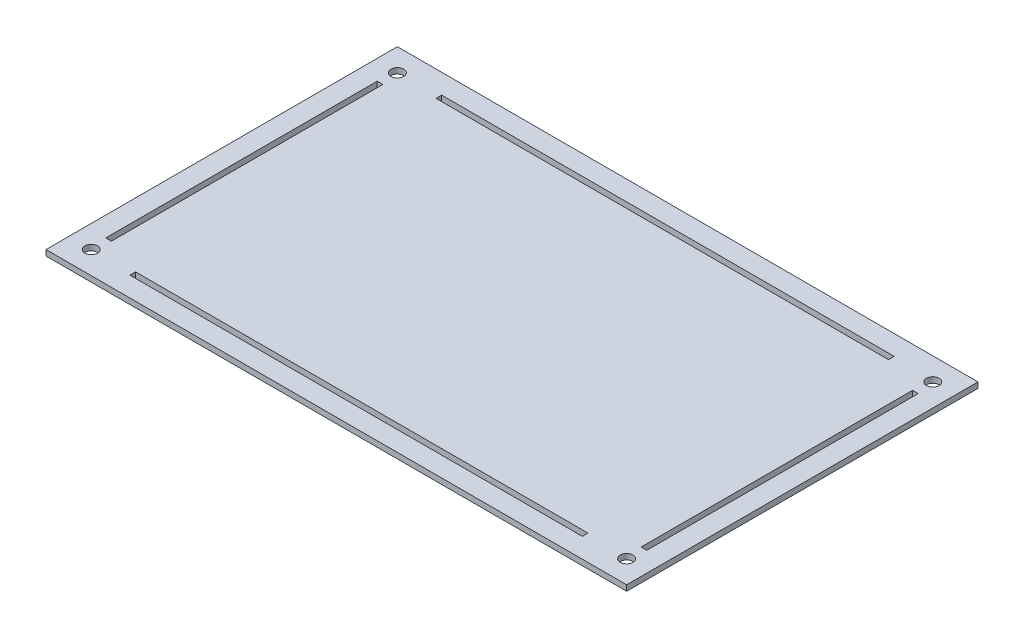
ISO-10303-21;
HEADER;
FILE_DESCRIPTION(('STEP AP214'),'2;1');
FILE_NAME('part.step','',(''),(''),'','','');
FILE_SCHEMA(('AUTOMOTIVE_DESIGN { 1 0 10303 214 1 1 1 1 }'));
ENDSEC;
DATA;
#1=APPLICATION_CONTEXT('core data for automotive mechanical design processes');
#2=APPLICATION_PROTOCOL_DEFINITION('international standard','automotive_design',2000,#1);
#3=PRODUCT_CONTEXT('',#1,'mechanical');
#4=PRODUCT('Part','Part','',(#3));
#5=PRODUCT_RELATED_PRODUCT_CATEGORY('part','',(#4));
#6=PRODUCT_DEFINITION_FORMATION('','',#4);
#7=PRODUCT_DEFINITION_CONTEXT('part definition',#1,'design');
#8=PRODUCT_DEFINITION('design','',#6,#7);
#9=PRODUCT_DEFINITION_SHAPE('','',#8);
#10=(LENGTH_UNIT() NAMED_UNIT(*) SI_UNIT(.MILLI.,.METRE.));
#11=(NAMED_UNIT(*) PLANE_ANGLE_UNIT() SI_UNIT($,.RADIAN.));
#12=(NAMED_UNIT(*) SI_UNIT($,.STERADIAN.) SOLID_ANGLE_UNIT());
#13=UNCERTAINTY_MEASURE_WITH_UNIT(LENGTH_MEASURE(1.E-05),#10,'distance_accuracy_value','');
#14=(GEOMETRIC_REPRESENTATION_CONTEXT(3) GLOBAL_UNCERTAINTY_ASSIGNED_CONTEXT((#13)) GLOBAL_UNIT_ASSIGNED_CONTEXT((#10,
#11,#12)) REPRESENTATION_CONTEXT('',''));
#15=CARTESIAN_POINT('',(0.,0.,0.));
#16=DIRECTION('',(0.,0.,1.));
#17=DIRECTION('',(1.,0.,0.));
#18=AXIS2_PLACEMENT_3D('',#15,#16,#17);
#19=CARTESIAN_POINT('',(-162.9918,3.175,-98.63963));
#20=DIRECTION('',(1.,0.,0.));
#21=DIRECTION('',(0.,0.,-1.));
#22=AXIS2_PLACEMENT_3D('',#19,#20,#21);
#23=PLANE('',#22);
#24=DIRECTION('',(0.,0.,1.));
#25=VECTOR('',#24,1.);
#26=CARTESIAN_POINT('',(-162.9918,0.,-98.63963));
#27=LINE('',#26,#25);
#28=CARTESIAN_POINT('',(-162.9918,0.,-98.63963));
#29=VERTEX_POINT('',#28);
#30=CARTESIAN_POINT('',(-162.9918,0.,98.63963));
#31=VERTEX_POINT('',#30);
#32=EDGE_CURVE('E332',#29,#31,#27,.T.);
#33=ORIENTED_EDGE('',*,*,#32,.T.);
#34=DIRECTION('',(0.,-1.,0.));
#35=VECTOR('',#34,1.);
#36=CARTESIAN_POINT('',(-162.9918,3.175,98.63963));
#37=LINE('',#36,#35);
#38=CARTESIAN_POINT('',(-162.9918,3.175,98.63963));
#39=VERTEX_POINT('',#38);
#40=EDGE_CURVE('E11',#39,#31,#37,.T.);
#41=ORIENTED_EDGE('',*,*,#40,.F.);
#42=DIRECTION('',(0.,0.,1.));
#43=VECTOR('',#42,1.);
#44=CARTESIAN_POINT('',(-162.9918,3.175,-98.63963));
#45=LINE('',#44,#43);
#46=CARTESIAN_POINT('',(-162.9918,3.175,-98.63963));
#47=VERTEX_POINT('',#46);
#48=EDGE_CURVE('E333',#47,#39,#45,.T.);
#49=ORIENTED_EDGE('',*,*,#48,.F.);
#50=DIRECTION('',(0.,-1.,0.));
#51=VECTOR('',#50,1.);
#52=CARTESIAN_POINT('',(-162.9918,3.175,-98.63963));
#53=LINE('',#52,#51);
#54=EDGE_CURVE('E343',#47,#29,#53,.T.);
#55=ORIENTED_EDGE('',*,*,#54,.T.);
#56=EDGE_LOOP('',(#33,#41,#49,#55));
#57=FACE_BOUND('',#56,.T.);
#58=ADVANCED_FACE('F39',(#57),#23,.F.);
#59=CARTESIAN_POINT('',(-162.9918,3.175,98.63963));
#60=DIRECTION('',(0.,0.,-1.));
#61=DIRECTION('',(-1.,0.,0.));
#62=AXIS2_PLACEMENT_3D('',#59,#60,#61);
#63=PLANE('',#62);
#64=DIRECTION('',(1.,0.,0.));
#65=VECTOR('',#64,1.);
#66=CARTESIAN_POINT('',(-162.9918,0.,98.63963));
#67=LINE('',#66,#65);
#68=CARTESIAN_POINT('',(162.9918,0.,98.63963));
#69=VERTEX_POINT('',#68);
#70=EDGE_CURVE('E346',#31,#69,#67,.T.);
#71=ORIENTED_EDGE('',*,*,#70,.T.);
#72=DIRECTION('',(0.,-1.,0.));
#73=VECTOR('',#72,1.);
#74=CARTESIAN_POINT('',(162.9918,3.175,98.63963));
#75=LINE('',#74,#73);
#76=CARTESIAN_POINT('',(162.9918,3.175,98.63963));
#77=VERTEX_POINT('',#76);
#78=EDGE_CURVE('E46',#77,#69,#75,.T.);
#79=ORIENTED_EDGE('',*,*,#78,.F.);
#80=DIRECTION('',(1.,0.,0.));
#81=VECTOR('',#80,1.);
#82=CARTESIAN_POINT('',(-162.9918,3.175,98.63963));
#83=LINE('',#82,#81);
#84=EDGE_CURVE('E336',#39,#77,#83,.T.);
#85=ORIENTED_EDGE('',*,*,#84,.F.);
#86=ORIENTED_EDGE('',*,*,#40,.T.);
#87=EDGE_LOOP('',(#71,#79,#85,#86));
#88=FACE_BOUND('',#87,.T.);
#89=ADVANCED_FACE('F375',(#88),#63,.F.);
#90=CARTESIAN_POINT('',(162.9918,3.175,-98.63963));
#91=DIRECTION('',(-1.,0.,0.));
#92=DIRECTION('',(0.,0.,1.));
#93=AXIS2_PLACEMENT_3D('',#90,#91,#92);
#94=PLANE('',#93);
#95=DIRECTION('',(0.,0.,-1.));
#96=VECTOR('',#95,1.);
#97=CARTESIAN_POINT('',(162.9918,0.,-98.63963));
#98=LINE('',#97,#96);
#99=CARTESIAN_POINT('',(162.9918,0.,-98.63963));
#100=VERTEX_POINT('',#99);
#101=EDGE_CURVE('E348',#69,#100,#98,.T.);
#102=ORIENTED_EDGE('',*,*,#101,.T.);
#103=DIRECTION('',(0.,-1.,0.));
#104=VECTOR('',#103,1.);
#105=CARTESIAN_POINT('',(162.9918,3.175,-98.63963));
#106=LINE('',#105,#104);
#107=CARTESIAN_POINT('',(162.9918,3.175,-98.63963));
#108=VERTEX_POINT('',#107);
#109=EDGE_CURVE('E353',#108,#100,#106,.T.);
#110=ORIENTED_EDGE('',*,*,#109,.F.);
#111=DIRECTION('',(0.,0.,-1.));
#112=VECTOR('',#111,1.);
#113=CARTESIAN_POINT('',(162.9918,3.175,-98.63963));
#114=LINE('',#113,#112);
#115=EDGE_CURVE('E339',#77,#108,#114,.T.);
#116=ORIENTED_EDGE('',*,*,#115,.F.);
#117=ORIENTED_EDGE('',*,*,#78,.T.);
#118=EDGE_LOOP('',(#102,#110,#116,#117));
#119=FACE_BOUND('',#118,.T.);
#120=ADVANCED_FACE('F360',(#119),#94,.F.);
#121=CARTESIAN_POINT('',(-162.9918,3.175,-98.63963));
#122=DIRECTION('',(0.,0.,1.));
#123=DIRECTION('',(1.,0.,0.));
#124=AXIS2_PLACEMENT_3D('',#121,#122,#123);
#125=PLANE('',#124);
#126=DIRECTION('',(-1.,0.,0.));
#127=VECTOR('',#126,1.);
#128=CARTESIAN_POINT('',(-162.9918,0.,-98.63963));
#129=LINE('',#128,#127);
#130=EDGE_CURVE('E337',#100,#29,#129,.T.);
#131=ORIENTED_EDGE('',*,*,#130,.T.);
#132=ORIENTED_EDGE('',*,*,#54,.F.);
#133=DIRECTION('',(-1.,0.,0.));
#134=VECTOR('',#133,1.);
#135=CARTESIAN_POINT('',(-162.9918,3.175,-98.63963));
#136=LINE('',#135,#134);
#137=EDGE_CURVE('E341',#108,#47,#136,.T.);
#138=ORIENTED_EDGE('',*,*,#137,.F.);
#139=ORIENTED_EDGE('',*,*,#109,.T.);
#140=EDGE_LOOP('',(#131,#132,#138,#139));
#141=FACE_BOUND('',#140,.T.);
#142=ADVANCED_FACE('F368',(#141),#125,.F.);
#143=CARTESIAN_POINT('',(0.,3.175,0.));
#144=DIRECTION('',(0.,1.,0.));
#145=DIRECTION('',(0.,0.,1.));
#146=AXIS2_PLACEMENT_3D('',#143,#144,#145);
#147=PLANE('',#146);
#148=DIRECTION('',(0.,0.,1.));
#149=VECTOR('',#148,1.);
#150=CARTESIAN_POINT('',(-151.8793,3.175,-76.1999999999992));
#151=LINE('',#150,#149);
#152=CARTESIAN_POINT('',(-151.8793,3.175,-76.1999999999992));
#153=VERTEX_POINT('',#152);
#154=CARTESIAN_POINT('',(-151.8793,3.175,76.2000000000008));
#155=VERTEX_POINT('',#154);
#156=EDGE_CURVE('E53',#153,#155,#151,.T.);
#157=ORIENTED_EDGE('',*,*,#156,.F.);
#158=DIRECTION('',(-1.,0.,0.));
#159=VECTOR('',#158,1.);
#160=CARTESIAN_POINT('',(-151.8793,3.175,-76.1999999999992));
#161=LINE('',#160,#159);
#162=CARTESIAN_POINT('',(-148.7043,3.175,-76.1999999999992));
#163=VERTEX_POINT('',#162);
#164=EDGE_CURVE('E196',#163,#153,#161,.T.);
#165=ORIENTED_EDGE('',*,*,#164,.F.);
#166=DIRECTION('',(0.,0.,-1.));
#167=VECTOR('',#166,1.);
#168=CARTESIAN_POINT('',(-148.7043,3.175,-76.1999999999992));
#169=LINE('',#168,#167);
#170=CARTESIAN_POINT('',(-148.7043,3.175,76.2000000000008));
#171=VERTEX_POINT('',#170);
#172=EDGE_CURVE('E199',#171,#163,#169,.T.);
#173=ORIENTED_EDGE('',*,*,#172,.F.);
#174=DIRECTION('',(1.,0.,0.));
#175=VECTOR('',#174,1.);
#176=CARTESIAN_POINT('',(-151.8793,3.175,76.2000000000008));
#177=LINE('',#176,#175);
#178=EDGE_CURVE('E205',#155,#171,#177,.T.);
#179=ORIENTED_EDGE('',*,*,#178,.F.);
#180=EDGE_LOOP('',(#157,#165,#173,#179));
#181=FACE_BOUND('',#180,.T.);
#182=DIRECTION('',(0.,0.,-1.));
#183=VECTOR('',#182,1.);
#184=CARTESIAN_POINT('',(151.8793,3.175,-76.1999999999992));
#185=LINE('',#184,#183);
#186=CARTESIAN_POINT('',(151.8793,3.175,76.2000000000008));
#187=VERTEX_POINT('',#186);
#188=CARTESIAN_POINT('',(151.8793,3.175,-76.1999999999992));
#189=VERTEX_POINT('',#188);
#190=EDGE_CURVE('E61',#187,#189,#185,.T.);
#191=ORIENTED_EDGE('',*,*,#190,.F.);
#192=DIRECTION('',(1.,0.,0.));
#193=VECTOR('',#192,1.);
#194=CARTESIAN_POINT('',(151.8793,3.175,76.2000000000008));
#195=LINE('',#194,#193);
#196=CARTESIAN_POINT('',(148.7043,3.175,76.2000000000008));
#197=VERTEX_POINT('',#196);
#198=EDGE_CURVE('E225',#197,#187,#195,.T.);
#199=ORIENTED_EDGE('',*,*,#198,.F.);
#200=DIRECTION('',(0.,0.,1.));
#201=VECTOR('',#200,1.);
#202=CARTESIAN_POINT('',(148.7043,3.175,-76.1999999999992));
#203=LINE('',#202,#201);
#204=CARTESIAN_POINT('',(148.7043,3.175,-76.1999999999992));
#205=VERTEX_POINT('',#204);
#206=EDGE_CURVE('E228',#205,#197,#203,.T.);
#207=ORIENTED_EDGE('',*,*,#206,.F.);
#208=DIRECTION('',(-1.,0.,0.));
#209=VECTOR('',#208,1.);
#210=CARTESIAN_POINT('',(151.8793,3.175,-76.1999999999992));
#211=LINE('',#210,#209);
#212=EDGE_CURVE('E232',#189,#205,#211,.T.);
#213=ORIENTED_EDGE('',*,*,#212,.F.);
#214=EDGE_LOOP('',(#191,#199,#207,#213));
#215=FACE_BOUND('',#214,.T.);
#216=DIRECTION('',(0.,0.,1.));
#217=VECTOR('',#216,1.);
#218=CARTESIAN_POINT('',(-127.,3.175,-87.52713));
#219=LINE('',#218,#217);
#220=CARTESIAN_POINT('',(-127.,3.175,-87.52713));
#221=VERTEX_POINT('',#220);
#222=CARTESIAN_POINT('',(-127.,3.175,-84.35213));
#223=VERTEX_POINT('',#222);
#224=EDGE_CURVE('E224',#221,#223,#219,.T.);
#225=ORIENTED_EDGE('',*,*,#224,.F.);
#226=DIRECTION('',(-1.,0.,0.));
#227=VECTOR('',#226,1.);
#228=CARTESIAN_POINT('',(-127.,3.175,-87.52713));
#229=LINE('',#228,#227);
#230=CARTESIAN_POINT('',(127.,3.175,-87.52713));
#231=VERTEX_POINT('',#230);
#232=EDGE_CURVE('E257',#231,#221,#229,.T.);
#233=ORIENTED_EDGE('',*,*,#232,.F.);
#234=DIRECTION('',(0.,0.,-1.));
#235=VECTOR('',#234,1.);
#236=CARTESIAN_POINT('',(127.,3.175,-87.52713));
#237=LINE('',#236,#235);
#238=CARTESIAN_POINT('',(127.,3.175,-84.35213));
#239=VERTEX_POINT('',#238);
#240=EDGE_CURVE('E260',#239,#231,#237,.T.);
#241=ORIENTED_EDGE('',*,*,#240,.F.);
#242=DIRECTION('',(1.,0.,0.));
#243=VECTOR('',#242,1.);
#244=CARTESIAN_POINT('',(-127.,3.175,-84.35213));
#245=LINE('',#244,#243);
#246=EDGE_CURVE('E264',#223,#239,#245,.T.);
#247=ORIENTED_EDGE('',*,*,#246,.F.);
#248=EDGE_LOOP('',(#225,#233,#241,#247));
#249=FACE_BOUND('',#248,.T.);
#250=DIRECTION('',(0.,0.,1.));
#251=VECTOR('',#250,1.);
#252=CARTESIAN_POINT('',(-127.,3.175,87.52713));
#253=LINE('',#252,#251);
#254=CARTESIAN_POINT('',(-127.,3.175,84.35213));
#255=VERTEX_POINT('',#254);
#256=CARTESIAN_POINT('',(-127.,3.175,87.52713));
#257=VERTEX_POINT('',#256);
#258=EDGE_CURVE('E256',#255,#257,#253,.T.);
#259=ORIENTED_EDGE('',*,*,#258,.F.);
#260=DIRECTION('',(-1.,0.,0.));
#261=VECTOR('',#260,1.);
#262=CARTESIAN_POINT('',(-127.,3.175,84.35213));
#263=LINE('',#262,#261);
#264=CARTESIAN_POINT('',(127.,3.175,84.35213));
#265=VERTEX_POINT('',#264);
#266=EDGE_CURVE('E288',#265,#255,#263,.T.);
#267=ORIENTED_EDGE('',*,*,#266,.F.);
#268=DIRECTION('',(0.,0.,-1.));
#269=VECTOR('',#268,1.);
#270=CARTESIAN_POINT('',(127.,3.175,87.52713));
#271=LINE('',#270,#269);
#272=CARTESIAN_POINT('',(127.,3.175,87.52713));
#273=VERTEX_POINT('',#272);
#274=EDGE_CURVE('E291',#273,#265,#271,.T.);
#275=ORIENTED_EDGE('',*,*,#274,.F.);
#276=DIRECTION('',(1.,0.,0.));
#277=VECTOR('',#276,1.);
#278=CARTESIAN_POINT('',(-127.,3.175,87.52713));
#279=LINE('',#278,#277);
#280=EDGE_CURVE('E295',#257,#273,#279,.T.);
#281=ORIENTED_EDGE('',*,*,#280,.F.);
#282=EDGE_LOOP('',(#259,#267,#275,#281));
#283=FACE_BOUND('',#282,.T.);
#284=CARTESIAN_POINT('',(-150.2918,3.175,-85.93963));
#285=DIRECTION('',(0.,1.,0.));
#286=DIRECTION('',(0.,0.,1.));
#287=AXIS2_PLACEMENT_3D('',#284,#285,#286);
#288=CIRCLE('',#287,3.57123999999998);
#289=CARTESIAN_POINT('',(-150.2918,3.175,-82.36839));
#290=VERTEX_POINT('',#289);
#291=EDGE_CURVE('E211',#290,#290,#288,.T.);
#292=ORIENTED_EDGE('',*,*,#291,.F.);
#293=EDGE_LOOP('',(#292));
#294=FACE_BOUND('',#293,.T.);
#295=CARTESIAN_POINT('',(150.2918,3.175,-85.93963));
#296=DIRECTION('',(0.,1.,0.));
#297=DIRECTION('',(0.,0.,1.));
#298=AXIS2_PLACEMENT_3D('',#295,#296,#297);
#299=CIRCLE('',#298,3.57123999999998);
#300=CARTESIAN_POINT('',(150.2918,3.175,-82.36839));
#301=VERTEX_POINT('',#300);
#302=EDGE_CURVE('E314',#301,#301,#299,.T.);
#303=ORIENTED_EDGE('',*,*,#302,.F.);
#304=EDGE_LOOP('',(#303));
#305=FACE_BOUND('',#304,.T.);
#306=CARTESIAN_POINT('',(150.2918,3.175,85.93963));
#307=DIRECTION('',(0.,1.,0.));
#308=DIRECTION('',(0.,0.,1.));
#309=AXIS2_PLACEMENT_3D('',#306,#307,#308);
#310=CIRCLE('',#309,3.57123999999998);
#311=CARTESIAN_POINT('',(150.2918,3.175,89.51087));
#312=VERTEX_POINT('',#311);
#313=EDGE_CURVE('E320',#312,#312,#310,.T.);
#314=ORIENTED_EDGE('',*,*,#313,.F.);
#315=EDGE_LOOP('',(#314));
#316=FACE_BOUND('',#315,.T.);
#317=CARTESIAN_POINT('',(-150.2918,3.175,85.93963));
#318=DIRECTION('',(0.,1.,0.));
#319=DIRECTION('',(0.,0.,1.));
#320=AXIS2_PLACEMENT_3D('',#317,#318,#319);
#321=CIRCLE('',#320,3.57123999999998);
#322=CARTESIAN_POINT('',(-150.2918,3.175,89.51087));
#323=VERTEX_POINT('',#322);
#324=EDGE_CURVE('E326',#323,#323,#321,.T.);
#325=ORIENTED_EDGE('',*,*,#324,.F.);
#326=EDGE_LOOP('',(#325));
#327=FACE_BOUND('',#326,.T.);
#328=ORIENTED_EDGE('',*,*,#48,.T.);
#329=ORIENTED_EDGE('',*,*,#84,.T.);
#330=ORIENTED_EDGE('',*,*,#115,.T.);
#331=ORIENTED_EDGE('',*,*,#137,.T.);
#332=EDGE_LOOP('',(#328,#329,#330,#331));
#333=FACE_BOUND('',#332,.T.);
#334=ADVANCED_FACE('F374',(#181,#215,#249,#283,#294,#305,#316,#327,#333),#147,.T.);
#335=CARTESIAN_POINT('',(0.,0.,0.));
#336=DIRECTION('',(0.,1.,0.));
#337=DIRECTION('',(0.,0.,1.));
#338=AXIS2_PLACEMENT_3D('',#335,#336,#337);
#339=PLANE('',#338);
#340=DIRECTION('',(-1.,0.,0.));
#341=VECTOR('',#340,1.);
#342=CARTESIAN_POINT('',(-151.8793,0.,-76.1999999999992));
#343=LINE('',#342,#341);
#344=CARTESIAN_POINT('',(-148.7043,0.,-76.1999999999992));
#345=VERTEX_POINT('',#344);
#346=CARTESIAN_POINT('',(-151.8793,0.,-76.1999999999992));
#347=VERTEX_POINT('',#346);
#348=EDGE_CURVE('E183',#345,#347,#343,.T.);
#349=ORIENTED_EDGE('',*,*,#348,.T.);
#350=DIRECTION('',(0.,0.,1.));
#351=VECTOR('',#350,1.);
#352=CARTESIAN_POINT('',(-151.8793,0.,-76.1999999999992));
#353=LINE('',#352,#351);
#354=CARTESIAN_POINT('',(-151.8793,0.,76.2000000000008));
#355=VERTEX_POINT('',#354);
#356=EDGE_CURVE('E177',#347,#355,#353,.T.);
#357=ORIENTED_EDGE('',*,*,#356,.T.);
#358=DIRECTION('',(1.,0.,0.));
#359=VECTOR('',#358,1.);
#360=CARTESIAN_POINT('',(-151.8793,0.,76.2000000000008));
#361=LINE('',#360,#359);
#362=CARTESIAN_POINT('',(-148.7043,0.,76.2000000000008));
#363=VERTEX_POINT('',#362);
#364=EDGE_CURVE('E187',#355,#363,#361,.T.);
#365=ORIENTED_EDGE('',*,*,#364,.T.);
#366=DIRECTION('',(0.,0.,-1.));
#367=VECTOR('',#366,1.);
#368=CARTESIAN_POINT('',(-148.7043,0.,-76.1999999999992));
#369=LINE('',#368,#367);
#370=EDGE_CURVE('E191',#363,#345,#369,.T.);
#371=ORIENTED_EDGE('',*,*,#370,.T.);
#372=EDGE_LOOP('',(#349,#357,#365,#371));
#373=FACE_BOUND('',#372,.T.);
#374=DIRECTION('',(1.,0.,0.));
#375=VECTOR('',#374,1.);
#376=CARTESIAN_POINT('',(151.8793,0.,76.2000000000008));
#377=LINE('',#376,#375);
#378=CARTESIAN_POINT('',(148.7043,0.,76.2000000000008));
#379=VERTEX_POINT('',#378);
#380=CARTESIAN_POINT('',(151.8793,0.,76.2000000000008));
#381=VERTEX_POINT('',#380);
#382=EDGE_CURVE('E217',#379,#381,#377,.T.);
#383=ORIENTED_EDGE('',*,*,#382,.T.);
#384=DIRECTION('',(0.,0.,-1.));
#385=VECTOR('',#384,1.);
#386=CARTESIAN_POINT('',(151.8793,0.,-76.1999999999992));
#387=LINE('',#386,#385);
#388=CARTESIAN_POINT('',(151.8793,0.,-76.1999999999992));
#389=VERTEX_POINT('',#388);
#390=EDGE_CURVE('E229',#381,#389,#387,.T.);
#391=ORIENTED_EDGE('',*,*,#390,.T.);
#392=DIRECTION('',(-1.,0.,0.));
#393=VECTOR('',#392,1.);
#394=CARTESIAN_POINT('',(151.8793,0.,-76.1999999999992));
#395=LINE('',#394,#393);
#396=CARTESIAN_POINT('',(148.7043,0.,-76.1999999999992));
#397=VERTEX_POINT('',#396);
#398=EDGE_CURVE('E241',#389,#397,#395,.T.);
#399=ORIENTED_EDGE('',*,*,#398,.T.);
#400=DIRECTION('',(0.,0.,1.));
#401=VECTOR('',#400,1.);
#402=CARTESIAN_POINT('',(148.7043,0.,-76.1999999999992));
#403=LINE('',#402,#401);
#404=EDGE_CURVE('E238',#397,#379,#403,.T.);
#405=ORIENTED_EDGE('',*,*,#404,.T.);
#406=EDGE_LOOP('',(#383,#391,#399,#405));
#407=FACE_BOUND('',#406,.T.);
#408=DIRECTION('',(-1.,0.,0.));
#409=VECTOR('',#408,1.);
#410=CARTESIAN_POINT('',(-127.,0.,-87.52713));
#411=LINE('',#410,#409);
#412=CARTESIAN_POINT('',(127.,0.,-87.52713));
#413=VERTEX_POINT('',#412);
#414=CARTESIAN_POINT('',(-127.,0.,-87.52713));
#415=VERTEX_POINT('',#414);
#416=EDGE_CURVE('E249',#413,#415,#411,.T.);
#417=ORIENTED_EDGE('',*,*,#416,.T.);
#418=DIRECTION('',(0.,0.,1.));
#419=VECTOR('',#418,1.);
#420=CARTESIAN_POINT('',(-127.,0.,-87.52713));
#421=LINE('',#420,#419);
#422=CARTESIAN_POINT('',(-127.,0.,-84.35213));
#423=VERTEX_POINT('',#422);
#424=EDGE_CURVE('E261',#415,#423,#421,.T.);
#425=ORIENTED_EDGE('',*,*,#424,.T.);
#426=DIRECTION('',(1.,0.,0.));
#427=VECTOR('',#426,1.);
#428=CARTESIAN_POINT('',(-127.,0.,-84.35213));
#429=LINE('',#428,#427);
#430=CARTESIAN_POINT('',(127.,0.,-84.35213));
#431=VERTEX_POINT('',#430);
#432=EDGE_CURVE('E273',#423,#431,#429,.T.);
#433=ORIENTED_EDGE('',*,*,#432,.T.);
#434=DIRECTION('',(0.,0.,-1.));
#435=VECTOR('',#434,1.);
#436=CARTESIAN_POINT('',(127.,0.,-87.52713));
#437=LINE('',#436,#435);
#438=EDGE_CURVE('E270',#431,#413,#437,.T.);
#439=ORIENTED_EDGE('',*,*,#438,.T.);
#440=EDGE_LOOP('',(#417,#425,#433,#439));
#441=FACE_BOUND('',#440,.T.);
#442=DIRECTION('',(-1.,0.,0.));
#443=VECTOR('',#442,1.);
#444=CARTESIAN_POINT('',(-127.,0.,84.35213));
#445=LINE('',#444,#443);
#446=CARTESIAN_POINT('',(127.,0.,84.35213));
#447=VERTEX_POINT('',#446);
#448=CARTESIAN_POINT('',(-127.,0.,84.35213));
#449=VERTEX_POINT('',#448);
#450=EDGE_CURVE('E281',#447,#449,#445,.T.);
#451=ORIENTED_EDGE('',*,*,#450,.T.);
#452=DIRECTION('',(0.,0.,1.));
#453=VECTOR('',#452,1.);
#454=CARTESIAN_POINT('',(-127.,0.,87.52713));
#455=LINE('',#454,#453);
#456=CARTESIAN_POINT('',(-127.,0.,87.52713));
#457=VERTEX_POINT('',#456);
#458=EDGE_CURVE('E292',#449,#457,#455,.T.);
#459=ORIENTED_EDGE('',*,*,#458,.T.);
#460=DIRECTION('',(1.,0.,0.));
#461=VECTOR('',#460,1.);
#462=CARTESIAN_POINT('',(-127.,0.,87.52713));
#463=LINE('',#462,#461);
#464=CARTESIAN_POINT('',(127.,0.,87.52713));
#465=VERTEX_POINT('',#464);
#466=EDGE_CURVE('E304',#457,#465,#463,.T.);
#467=ORIENTED_EDGE('',*,*,#466,.T.);
#468=DIRECTION('',(0.,0.,-1.));
#469=VECTOR('',#468,1.);
#470=CARTESIAN_POINT('',(127.,0.,87.52713));
#471=LINE('',#470,#469);
#472=EDGE_CURVE('E301',#465,#447,#471,.T.);
#473=ORIENTED_EDGE('',*,*,#472,.T.);
#474=EDGE_LOOP('',(#451,#459,#467,#473));
#475=FACE_BOUND('',#474,.T.);
#476=CARTESIAN_POINT('',(-150.2918,0.,-85.93963));
#477=DIRECTION('',(0.,1.,0.));
#478=DIRECTION('',(0.,0.,1.));
#479=AXIS2_PLACEMENT_3D('',#476,#477,#478);
#480=CIRCLE('',#479,3.57124);
#481=CARTESIAN_POINT('',(-150.2918,0.,-82.36839));
#482=VERTEX_POINT('',#481);
#483=EDGE_CURVE('E311',#482,#482,#480,.T.);
#484=ORIENTED_EDGE('',*,*,#483,.T.);
#485=EDGE_LOOP('',(#484));
#486=FACE_BOUND('',#485,.T.);
#487=CARTESIAN_POINT('',(150.2918,0.,-85.93963));
#488=DIRECTION('',(0.,1.,0.));
#489=DIRECTION('',(0.,0.,1.));
#490=AXIS2_PLACEMENT_3D('',#487,#488,#489);
#491=CIRCLE('',#490,3.57124);
#492=CARTESIAN_POINT('',(150.2918,0.,-82.36839));
#493=VERTEX_POINT('',#492);
#494=EDGE_CURVE('E317',#493,#493,#491,.T.);
#495=ORIENTED_EDGE('',*,*,#494,.T.);
#496=EDGE_LOOP('',(#495));
#497=FACE_BOUND('',#496,.T.);
#498=CARTESIAN_POINT('',(150.2918,0.,85.93963));
#499=DIRECTION('',(0.,1.,0.));
#500=DIRECTION('',(0.,0.,1.));
#501=AXIS2_PLACEMENT_3D('',#498,#499,#500);
#502=CIRCLE('',#501,3.57124);
#503=CARTESIAN_POINT('',(150.2918,0.,89.51087));
#504=VERTEX_POINT('',#503);
#505=EDGE_CURVE('E323',#504,#504,#502,.T.);
#506=ORIENTED_EDGE('',*,*,#505,.T.);
#507=EDGE_LOOP('',(#506));
#508=FACE_BOUND('',#507,.T.);
#509=CARTESIAN_POINT('',(-150.2918,0.,85.93963));
#510=DIRECTION('',(0.,1.,0.));
#511=DIRECTION('',(0.,0.,1.));
#512=AXIS2_PLACEMENT_3D('',#509,#510,#511);
#513=CIRCLE('',#512,3.57124);
#514=CARTESIAN_POINT('',(-150.2918,0.,89.51087));
#515=VERTEX_POINT('',#514);
#516=EDGE_CURVE('E329',#515,#515,#513,.T.);
#517=ORIENTED_EDGE('',*,*,#516,.T.);
#518=EDGE_LOOP('',(#517));
#519=FACE_BOUND('',#518,.T.);
#520=ORIENTED_EDGE('',*,*,#32,.F.);
#521=ORIENTED_EDGE('',*,*,#130,.F.);
#522=ORIENTED_EDGE('',*,*,#101,.F.);
#523=ORIENTED_EDGE('',*,*,#70,.F.);
#524=EDGE_LOOP('',(#520,#521,#522,#523));
#525=FACE_BOUND('',#524,.T.);
#526=ADVANCED_FACE('F193',(#373,#407,#441,#475,#486,#497,#508,#519,#525),#339,.F.);
#527=CARTESIAN_POINT('',(-150.2918,3.175,85.93963));
#528=DIRECTION('',(0.,1.,0.));
#529=DIRECTION('',(0.,0.,1.));
#530=AXIS2_PLACEMENT_3D('',#527,#528,#529);
#531=CYLINDRICAL_SURFACE('',#530,3.57123999999999);
#532=ORIENTED_EDGE('',*,*,#516,.F.);
#533=EDGE_LOOP('',(#532));
#534=FACE_BOUND('',#533,.T.);
#535=ORIENTED_EDGE('',*,*,#324,.T.);
#536=EDGE_LOOP('',(#535));
#537=FACE_BOUND('',#536,.T.);
#538=ADVANCED_FACE('F387',(#534,#537),#531,.F.);
#539=CARTESIAN_POINT('',(150.2918,3.175,85.93963));
#540=DIRECTION('',(0.,1.,0.));
#541=DIRECTION('',(0.,0.,1.));
#542=AXIS2_PLACEMENT_3D('',#539,#540,#541);
#543=CYLINDRICAL_SURFACE('',#542,3.57123999999999);
#544=ORIENTED_EDGE('',*,*,#505,.F.);
#545=EDGE_LOOP('',(#544));
#546=FACE_BOUND('',#545,.T.);
#547=ORIENTED_EDGE('',*,*,#313,.T.);
#548=EDGE_LOOP('',(#547));
#549=FACE_BOUND('',#548,.T.);
#550=ADVANCED_FACE('F393',(#546,#549),#543,.F.);
#551=CARTESIAN_POINT('',(150.2918,3.175,-85.93963));
#552=DIRECTION('',(0.,1.,0.));
#553=DIRECTION('',(0.,0.,1.));
#554=AXIS2_PLACEMENT_3D('',#551,#552,#553);
#555=CYLINDRICAL_SURFACE('',#554,3.57123999999999);
#556=ORIENTED_EDGE('',*,*,#494,.F.);
#557=EDGE_LOOP('',(#556));
#558=FACE_BOUND('',#557,.T.);
#559=ORIENTED_EDGE('',*,*,#302,.T.);
#560=EDGE_LOOP('',(#559));
#561=FACE_BOUND('',#560,.T.);
#562=ADVANCED_FACE('F397',(#558,#561),#555,.F.);
#563=CARTESIAN_POINT('',(-150.2918,3.175,-85.93963));
#564=DIRECTION('',(0.,1.,0.));
#565=DIRECTION('',(0.,0.,1.));
#566=AXIS2_PLACEMENT_3D('',#563,#564,#565);
#567=CYLINDRICAL_SURFACE('',#566,3.57123999999999);
#568=ORIENTED_EDGE('',*,*,#483,.F.);
#569=EDGE_LOOP('',(#568));
#570=FACE_BOUND('',#569,.T.);
#571=ORIENTED_EDGE('',*,*,#291,.T.);
#572=EDGE_LOOP('',(#571));
#573=FACE_BOUND('',#572,.T.);
#574=ADVANCED_FACE('F401',(#570,#573),#567,.F.);
#575=CARTESIAN_POINT('',(-127.,0.,87.52713));
#576=DIRECTION('',(-1.,0.,0.));
#577=DIRECTION('',(0.,0.,1.));
#578=AXIS2_PLACEMENT_3D('',#575,#576,#577);
#579=PLANE('',#578);
#580=ORIENTED_EDGE('',*,*,#258,.T.);
#581=DIRECTION('',(0.,1.,0.));
#582=VECTOR('',#581,1.);
#583=CARTESIAN_POINT('',(-127.,0.,87.52713));
#584=LINE('',#583,#582);
#585=EDGE_CURVE('E278',#457,#257,#584,.T.);
#586=ORIENTED_EDGE('',*,*,#585,.F.);
#587=ORIENTED_EDGE('',*,*,#458,.F.);
#588=DIRECTION('',(0.,1.,0.));
#589=VECTOR('',#588,1.);
#590=CARTESIAN_POINT('',(-127.,0.,84.35213));
#591=LINE('',#590,#589);
#592=EDGE_CURVE('E286',#449,#255,#591,.T.);
#593=ORIENTED_EDGE('',*,*,#592,.T.);
#594=EDGE_LOOP('',(#580,#586,#587,#593));
#595=FACE_BOUND('',#594,.T.);
#596=ADVANCED_FACE('F405',(#595),#579,.F.);
#597=CARTESIAN_POINT('',(-127.,0.,84.35213));
#598=DIRECTION('',(0.,0.,-1.));
#599=DIRECTION('',(-1.,0.,0.));
#600=AXIS2_PLACEMENT_3D('',#597,#598,#599);
#601=PLANE('',#600);
#602=ORIENTED_EDGE('',*,*,#266,.T.);
#603=ORIENTED_EDGE('',*,*,#592,.F.);
#604=ORIENTED_EDGE('',*,*,#450,.F.);
#605=DIRECTION('',(0.,1.,0.));
#606=VECTOR('',#605,1.);
#607=CARTESIAN_POINT('',(127.,0.,84.35213));
#608=LINE('',#607,#606);
#609=EDGE_CURVE('E284',#447,#265,#608,.T.);
#610=ORIENTED_EDGE('',*,*,#609,.T.);
#611=EDGE_LOOP('',(#602,#603,#604,#610));
#612=FACE_BOUND('',#611,.T.);
#613=ADVANCED_FACE('F407',(#612),#601,.F.);
#614=CARTESIAN_POINT('',(127.,0.,87.52713));
#615=DIRECTION('',(1.,0.,0.));
#616=DIRECTION('',(0.,0.,-1.));
#617=AXIS2_PLACEMENT_3D('',#614,#615,#616);
#618=PLANE('',#617);
#619=ORIENTED_EDGE('',*,*,#274,.T.);
#620=ORIENTED_EDGE('',*,*,#609,.F.);
#621=ORIENTED_EDGE('',*,*,#472,.F.);
#622=DIRECTION('',(0.,1.,0.));
#623=VECTOR('',#622,1.);
#624=CARTESIAN_POINT('',(127.,0.,87.52713));
#625=LINE('',#624,#623);
#626=EDGE_CURVE('E282',#465,#273,#625,.T.);
#627=ORIENTED_EDGE('',*,*,#626,.T.);
#628=EDGE_LOOP('',(#619,#620,#621,#627));
#629=FACE_BOUND('',#628,.T.);
#630=ADVANCED_FACE('F410',(#629),#618,.F.);
#631=CARTESIAN_POINT('',(-127.,0.,87.52713));
#632=DIRECTION('',(0.,0.,1.));
#633=DIRECTION('',(1.,0.,0.));
#634=AXIS2_PLACEMENT_3D('',#631,#632,#633);
#635=PLANE('',#634);
#636=ORIENTED_EDGE('',*,*,#280,.T.);
#637=ORIENTED_EDGE('',*,*,#626,.F.);
#638=ORIENTED_EDGE('',*,*,#466,.F.);
#639=ORIENTED_EDGE('',*,*,#585,.T.);
#640=EDGE_LOOP('',(#636,#637,#638,#639));
#641=FACE_BOUND('',#640,.T.);
#642=ADVANCED_FACE('F414',(#641),#635,.F.);
#643=CARTESIAN_POINT('',(-127.,0.,-87.52713));
#644=DIRECTION('',(-1.,0.,0.));
#645=DIRECTION('',(0.,0.,1.));
#646=AXIS2_PLACEMENT_3D('',#643,#644,#645);
#647=PLANE('',#646);
#648=ORIENTED_EDGE('',*,*,#224,.T.);
#649=DIRECTION('',(0.,1.,0.));
#650=VECTOR('',#649,1.);
#651=CARTESIAN_POINT('',(-127.,0.,-84.35213));
#652=LINE('',#651,#650);
#653=EDGE_CURVE('E246',#423,#223,#652,.T.);
#654=ORIENTED_EDGE('',*,*,#653,.F.);
#655=ORIENTED_EDGE('',*,*,#424,.F.);
#656=DIRECTION('',(0.,1.,0.));
#657=VECTOR('',#656,1.);
#658=CARTESIAN_POINT('',(-127.,0.,-87.52713));
#659=LINE('',#658,#657);
#660=EDGE_CURVE('E254',#415,#221,#659,.T.);
#661=ORIENTED_EDGE('',*,*,#660,.T.);
#662=EDGE_LOOP('',(#648,#654,#655,#661));
#663=FACE_BOUND('',#662,.T.);
#664=ADVANCED_FACE('F418',(#663),#647,.F.);
#665=CARTESIAN_POINT('',(-127.,0.,-87.52713));
#666=DIRECTION('',(0.,0.,-1.));
#667=DIRECTION('',(-1.,0.,0.));
#668=AXIS2_PLACEMENT_3D('',#665,#666,#667);
#669=PLANE('',#668);
#670=ORIENTED_EDGE('',*,*,#232,.T.);
#671=ORIENTED_EDGE('',*,*,#660,.F.);
#672=ORIENTED_EDGE('',*,*,#416,.F.);
#673=DIRECTION('',(0.,1.,0.));
#674=VECTOR('',#673,1.);
#675=CARTESIAN_POINT('',(127.,0.,-87.52713));
#676=LINE('',#675,#674);
#677=EDGE_CURVE('E252',#413,#231,#676,.T.);
#678=ORIENTED_EDGE('',*,*,#677,.T.);
#679=EDGE_LOOP('',(#670,#671,#672,#678));
#680=FACE_BOUND('',#679,.T.);
#681=ADVANCED_FACE('F423',(#680),#669,.F.);
#682=CARTESIAN_POINT('',(127.,0.,-87.52713));
#683=DIRECTION('',(1.,0.,0.));
#684=DIRECTION('',(0.,0.,-1.));
#685=AXIS2_PLACEMENT_3D('',#682,#683,#684);
#686=PLANE('',#685);
#687=ORIENTED_EDGE('',*,*,#240,.T.);
#688=ORIENTED_EDGE('',*,*,#677,.F.);
#689=ORIENTED_EDGE('',*,*,#438,.F.);
#690=DIRECTION('',(0.,1.,0.));
#691=VECTOR('',#690,1.);
#692=CARTESIAN_POINT('',(127.,0.,-84.35213));
#693=LINE('',#692,#691);
#694=EDGE_CURVE('E250',#431,#239,#693,.T.);
#695=ORIENTED_EDGE('',*,*,#694,.T.);
#696=EDGE_LOOP('',(#687,#688,#689,#695));
#697=FACE_BOUND('',#696,.T.);
#698=ADVANCED_FACE('F426',(#697),#686,.F.);
#699=CARTESIAN_POINT('',(-127.,0.,-84.35213));
#700=DIRECTION('',(0.,0.,1.));
#701=DIRECTION('',(1.,0.,0.));
#702=AXIS2_PLACEMENT_3D('',#699,#700,#701);
#703=PLANE('',#702);
#704=ORIENTED_EDGE('',*,*,#246,.T.);
#705=ORIENTED_EDGE('',*,*,#694,.F.);
#706=ORIENTED_EDGE('',*,*,#432,.F.);
#707=ORIENTED_EDGE('',*,*,#653,.T.);
#708=EDGE_LOOP('',(#704,#705,#706,#707));
#709=FACE_BOUND('',#708,.T.);
#710=ADVANCED_FACE('F430',(#709),#703,.F.);
#711=CARTESIAN_POINT('',(151.8793,0.,-76.1999999999992));
#712=DIRECTION('',(1.,0.,0.));
#713=DIRECTION('',(0.,0.,-1.));
#714=AXIS2_PLACEMENT_3D('',#711,#712,#713);
#715=PLANE('',#714);
#716=ORIENTED_EDGE('',*,*,#190,.T.);
#717=DIRECTION('',(0.,1.,0.));
#718=VECTOR('',#717,1.);
#719=CARTESIAN_POINT('',(151.8793,0.,-76.1999999999992));
#720=LINE('',#719,#718);
#721=EDGE_CURVE('E215',#389,#189,#720,.T.);
#722=ORIENTED_EDGE('',*,*,#721,.F.);
#723=ORIENTED_EDGE('',*,*,#390,.F.);
#724=DIRECTION('',(0.,1.,0.));
#725=VECTOR('',#724,1.);
#726=CARTESIAN_POINT('',(151.8793,0.,76.2000000000008));
#727=LINE('',#726,#725);
#728=EDGE_CURVE('E222',#381,#187,#727,.T.);
#729=ORIENTED_EDGE('',*,*,#728,.T.);
#730=EDGE_LOOP('',(#716,#722,#723,#729));
#731=FACE_BOUND('',#730,.T.);
#732=ADVANCED_FACE('F434',(#731),#715,.F.);
#733=CARTESIAN_POINT('',(151.8793,0.,76.2000000000008));
#734=DIRECTION('',(0.,0.,1.));
#735=DIRECTION('',(1.,0.,0.));
#736=AXIS2_PLACEMENT_3D('',#733,#734,#735);
#737=PLANE('',#736);
#738=ORIENTED_EDGE('',*,*,#198,.T.);
#739=ORIENTED_EDGE('',*,*,#728,.F.);
#740=ORIENTED_EDGE('',*,*,#382,.F.);
#741=DIRECTION('',(0.,1.,0.));
#742=VECTOR('',#741,1.);
#743=CARTESIAN_POINT('',(148.7043,0.,76.2000000000008));
#744=LINE('',#743,#742);
#745=EDGE_CURVE('E220',#379,#197,#744,.T.);
#746=ORIENTED_EDGE('',*,*,#745,.T.);
#747=EDGE_LOOP('',(#738,#739,#740,#746));
#748=FACE_BOUND('',#747,.T.);
#749=ADVANCED_FACE('F439',(#748),#737,.F.);
#750=CARTESIAN_POINT('',(148.7043,0.,-76.1999999999992));
#751=DIRECTION('',(-1.,0.,0.));
#752=DIRECTION('',(0.,0.,1.));
#753=AXIS2_PLACEMENT_3D('',#750,#751,#752);
#754=PLANE('',#753);
#755=ORIENTED_EDGE('',*,*,#206,.T.);
#756=ORIENTED_EDGE('',*,*,#745,.F.);
#757=ORIENTED_EDGE('',*,*,#404,.F.);
#758=DIRECTION('',(0.,1.,0.));
#759=VECTOR('',#758,1.);
#760=CARTESIAN_POINT('',(148.7043,0.,-76.1999999999992));
#761=LINE('',#760,#759);
#762=EDGE_CURVE('E218',#397,#205,#761,.T.);
#763=ORIENTED_EDGE('',*,*,#762,.T.);
#764=EDGE_LOOP('',(#755,#756,#757,#763));
#765=FACE_BOUND('',#764,.T.);
#766=ADVANCED_FACE('F442',(#765),#754,.F.);
#767=CARTESIAN_POINT('',(151.8793,0.,-76.1999999999992));
#768=DIRECTION('',(0.,0.,-1.));
#769=DIRECTION('',(-1.,0.,0.));
#770=AXIS2_PLACEMENT_3D('',#767,#768,#769);
#771=PLANE('',#770);
#772=ORIENTED_EDGE('',*,*,#212,.T.);
#773=ORIENTED_EDGE('',*,*,#762,.F.);
#774=ORIENTED_EDGE('',*,*,#398,.F.);
#775=ORIENTED_EDGE('',*,*,#721,.T.);
#776=EDGE_LOOP('',(#772,#773,#774,#775));
#777=FACE_BOUND('',#776,.T.);
#778=ADVANCED_FACE('F446',(#777),#771,.F.);
#779=CARTESIAN_POINT('',(-151.8793,0.,-76.1999999999992));
#780=DIRECTION('',(-1.,0.,0.));
#781=DIRECTION('',(0.,0.,1.));
#782=AXIS2_PLACEMENT_3D('',#779,#780,#781);
#783=PLANE('',#782);
#784=ORIENTED_EDGE('',*,*,#156,.T.);
#785=DIRECTION('',(0.,1.,0.));
#786=VECTOR('',#785,1.);
#787=CARTESIAN_POINT('',(-151.8793,0.,76.2000000000008));
#788=LINE('',#787,#786);
#789=EDGE_CURVE('E173',#355,#155,#788,.T.);
#790=ORIENTED_EDGE('',*,*,#789,.F.);
#791=ORIENTED_EDGE('',*,*,#356,.F.);
#792=DIRECTION('',(0.,1.,0.));
#793=VECTOR('',#792,1.);
#794=CARTESIAN_POINT('',(-151.8793,0.,-76.1999999999992));
#795=LINE('',#794,#793);
#796=EDGE_CURVE('E209',#347,#153,#795,.T.);
#797=ORIENTED_EDGE('',*,*,#796,.T.);
#798=EDGE_LOOP('',(#784,#790,#791,#797));
#799=FACE_BOUND('',#798,.T.);
#800=ADVANCED_FACE('F175',(#799),#783,.F.);
#801=CARTESIAN_POINT('',(-151.8793,0.,-76.1999999999992));
#802=DIRECTION('',(0.,0.,-1.));
#803=DIRECTION('',(-1.,0.,0.));
#804=AXIS2_PLACEMENT_3D('',#801,#802,#803);
#805=PLANE('',#804);
#806=ORIENTED_EDGE('',*,*,#164,.T.);
#807=ORIENTED_EDGE('',*,*,#796,.F.);
#808=ORIENTED_EDGE('',*,*,#348,.F.);
#809=DIRECTION('',(0.,1.,0.));
#810=VECTOR('',#809,1.);
#811=CARTESIAN_POINT('',(-148.7043,0.,-76.1999999999992));
#812=LINE('',#811,#810);
#813=EDGE_CURVE('E212',#345,#163,#812,.T.);
#814=ORIENTED_EDGE('',*,*,#813,.T.);
#815=EDGE_LOOP('',(#806,#807,#808,#814));
#816=FACE_BOUND('',#815,.T.);
#817=ADVANCED_FACE('F455',(#816),#805,.F.);
#818=CARTESIAN_POINT('',(-148.7043,0.,-76.1999999999992));
#819=DIRECTION('',(1.,0.,0.));
#820=DIRECTION('',(0.,0.,-1.));
#821=AXIS2_PLACEMENT_3D('',#818,#819,#820);
#822=PLANE('',#821);
#823=ORIENTED_EDGE('',*,*,#172,.T.);
#824=ORIENTED_EDGE('',*,*,#813,.F.);
#825=ORIENTED_EDGE('',*,*,#370,.F.);
#826=DIRECTION('',(0.,1.,0.));
#827=VECTOR('',#826,1.);
#828=CARTESIAN_POINT('',(-148.7043,0.,76.2000000000008));
#829=LINE('',#828,#827);
#830=EDGE_CURVE('E182',#363,#171,#829,.T.);
#831=ORIENTED_EDGE('',*,*,#830,.T.);
#832=EDGE_LOOP('',(#823,#824,#825,#831));
#833=FACE_BOUND('',#832,.T.);
#834=ADVANCED_FACE('F458',(#833),#822,.F.);
#835=CARTESIAN_POINT('',(-151.8793,0.,76.2000000000008));
#836=DIRECTION('',(0.,0.,1.));
#837=DIRECTION('',(1.,0.,0.));
#838=AXIS2_PLACEMENT_3D('',#835,#836,#837);
#839=PLANE('',#838);
#840=ORIENTED_EDGE('',*,*,#178,.T.);
#841=ORIENTED_EDGE('',*,*,#830,.F.);
#842=ORIENTED_EDGE('',*,*,#364,.F.);
#843=ORIENTED_EDGE('',*,*,#789,.T.);
#844=EDGE_LOOP('',(#840,#841,#842,#843));
#845=FACE_BOUND('',#844,.T.);
#846=ADVANCED_FACE('F188',(#845),#839,.F.);
#847=CLOSED_SHELL('',(#58,#89,#120,#142,#334,#526,#538,#550,#562,#574,#596,#613,#630,#642,#664,
#681,#698,#710,#732,#749,#766,#778,#800,#817,#834,#846));
#848=MANIFOLD_SOLID_BREP('B2',#847);
#849=ADVANCED_BREP_SHAPE_REPRESENTATION('',(#18,#848),#14);
#850=SHAPE_DEFINITION_REPRESENTATION(#9,#849);
ENDSEC;
END-ISO-10303-21;
